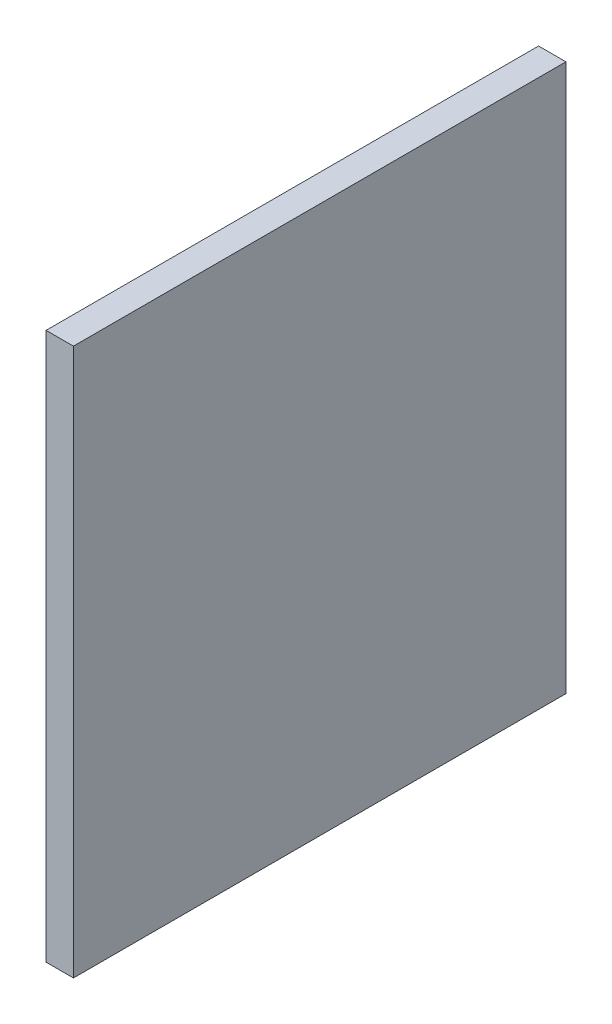
ISO-10303-21;
HEADER;
FILE_DESCRIPTION(('STEP AP214'),'2;1');
FILE_NAME('part.step','',(''),(''),'','','');
FILE_SCHEMA(('AUTOMOTIVE_DESIGN { 1 0 10303 214 1 1 1 1 }'));
ENDSEC;
DATA;
#1=APPLICATION_CONTEXT('core data for automotive mechanical design processes');
#2=APPLICATION_PROTOCOL_DEFINITION('international standard','automotive_design',2000,#1);
#3=PRODUCT_CONTEXT('',#1,'mechanical');
#4=PRODUCT('Part','Part','',(#3));
#5=PRODUCT_RELATED_PRODUCT_CATEGORY('part','',(#4));
#6=PRODUCT_DEFINITION_FORMATION('','',#4);
#7=PRODUCT_DEFINITION_CONTEXT('part definition',#1,'design');
#8=PRODUCT_DEFINITION('design','',#6,#7);
#9=PRODUCT_DEFINITION_SHAPE('','',#8);
#10=(LENGTH_UNIT() NAMED_UNIT(*) SI_UNIT(.MILLI.,.METRE.));
#11=(NAMED_UNIT(*) PLANE_ANGLE_UNIT() SI_UNIT($,.RADIAN.));
#12=(NAMED_UNIT(*) SI_UNIT($,.STERADIAN.) SOLID_ANGLE_UNIT());
#13=UNCERTAINTY_MEASURE_WITH_UNIT(LENGTH_MEASURE(1.E-05),#10,'distance_accuracy_value','');
#14=(GEOMETRIC_REPRESENTATION_CONTEXT(3) GLOBAL_UNCERTAINTY_ASSIGNED_CONTEXT((#13)) GLOBAL_UNIT_ASSIGNED_CONTEXT((#10,
#11,#12)) REPRESENTATION_CONTEXT('',''));
#15=CARTESIAN_POINT('',(0.,0.,0.));
#16=DIRECTION('',(0.,0.,1.));
#17=DIRECTION('',(1.,0.,0.));
#18=AXIS2_PLACEMENT_3D('',#15,#16,#17);
#19=CARTESIAN_POINT('',(10.,0.,0.));
#20=DIRECTION('',(0.,1.,0.));
#21=DIRECTION('',(0.,0.,1.));
#22=AXIS2_PLACEMENT_3D('',#19,#20,#21);
#23=PLANE('',#22);
#24=DIRECTION('',(1.,0.,0.));
#25=VECTOR('',#24,1.);
#26=CARTESIAN_POINT('',(0.,0.,-150.));
#27=LINE('',#26,#25);
#28=CARTESIAN_POINT('',(0.,0.,-150.));
#29=VERTEX_POINT('',#28);
#30=CARTESIAN_POINT('',(10.,0.,-150.));
#31=VERTEX_POINT('',#30);
#32=EDGE_CURVE('E116',#29,#31,#27,.T.);
#33=ORIENTED_EDGE('',*,*,#32,.F.);
#34=DIRECTION('',(0.,0.,-1.));
#35=VECTOR('',#34,1.);
#36=CARTESIAN_POINT('',(0.,0.,0.));
#37=LINE('',#36,#35);
#38=CARTESIAN_POINT('',(0.,0.,-330.));
#39=VERTEX_POINT('',#38);
#40=EDGE_CURVE('E90',#29,#39,#37,.T.);
#41=ORIENTED_EDGE('',*,*,#40,.T.);
#42=DIRECTION('',(-1.,0.,0.));
#43=VECTOR('',#42,1.);
#44=CARTESIAN_POINT('',(10.,0.,-330.));
#45=LINE('',#44,#43);
#46=CARTESIAN_POINT('',(10.,0.,-330.));
#47=VERTEX_POINT('',#46);
#48=EDGE_CURVE('E11',#47,#39,#45,.T.);
#49=ORIENTED_EDGE('',*,*,#48,.F.);
#50=DIRECTION('',(0.,0.,-1.));
#51=VECTOR('',#50,1.);
#52=CARTESIAN_POINT('',(10.,0.,0.));
#53=LINE('',#52,#51);
#54=EDGE_CURVE('E100',#31,#47,#53,.T.);
#55=ORIENTED_EDGE('',*,*,#54,.F.);
#56=EDGE_LOOP('',(#33,#41,#49,#55));
#57=FACE_BOUND('',#56,.T.);
#58=ADVANCED_FACE('F44',(#57),#23,.F.);
#59=CARTESIAN_POINT('',(10.,200.,0.));
#60=DIRECTION('',(0.,-1.,0.));
#61=DIRECTION('',(0.,0.,-1.));
#62=AXIS2_PLACEMENT_3D('',#59,#60,#61);
#63=PLANE('',#62);
#64=DIRECTION('',(-1.,0.,0.));
#65=VECTOR('',#64,1.);
#66=CARTESIAN_POINT('',(0.,200.,-150.));
#67=LINE('',#66,#65);
#68=CARTESIAN_POINT('',(10.,200.,-150.));
#69=VERTEX_POINT('',#68);
#70=CARTESIAN_POINT('',(0.,200.,-150.));
#71=VERTEX_POINT('',#70);
#72=EDGE_CURVE('E59',#69,#71,#67,.T.);
#73=ORIENTED_EDGE('',*,*,#72,.F.);
#74=DIRECTION('',(0.,0.,1.));
#75=VECTOR('',#74,1.);
#76=CARTESIAN_POINT('',(10.,200.,0.));
#77=LINE('',#76,#75);
#78=CARTESIAN_POINT('',(10.,200.,-330.));
#79=VERTEX_POINT('',#78);
#80=EDGE_CURVE('E95',#79,#69,#77,.T.);
#81=ORIENTED_EDGE('',*,*,#80,.F.);
#82=DIRECTION('',(-1.,0.,0.));
#83=VECTOR('',#82,1.);
#84=CARTESIAN_POINT('',(10.,200.,-330.));
#85=LINE('',#84,#83);
#86=CARTESIAN_POINT('',(0.,200.,-330.));
#87=VERTEX_POINT('',#86);
#88=EDGE_CURVE('E52',#79,#87,#85,.T.);
#89=ORIENTED_EDGE('',*,*,#88,.T.);
#90=DIRECTION('',(0.,0.,1.));
#91=VECTOR('',#90,1.);
#92=CARTESIAN_POINT('',(0.,200.,0.));
#93=LINE('',#92,#91);
#94=EDGE_CURVE('E89',#87,#71,#93,.T.);
#95=ORIENTED_EDGE('',*,*,#94,.T.);
#96=EDGE_LOOP('',(#73,#81,#89,#95));
#97=FACE_BOUND('',#96,.T.);
#98=ADVANCED_FACE('F94',(#97),#63,.F.);
#99=CARTESIAN_POINT('',(10.,0.,0.));
#100=DIRECTION('',(-1.,0.,0.));
#101=DIRECTION('',(0.,0.,1.));
#102=AXIS2_PLACEMENT_3D('',#99,#100,#101);
#103=PLANE('',#102);
#104=DIRECTION('',(0.,1.,0.));
#105=VECTOR('',#104,1.);
#106=CARTESIAN_POINT('',(10.,200.,-150.));
#107=LINE('',#106,#105);
#108=EDGE_CURVE('E113',#31,#69,#107,.T.);
#109=ORIENTED_EDGE('',*,*,#108,.F.);
#110=ORIENTED_EDGE('',*,*,#54,.T.);
#111=DIRECTION('',(0.,1.,0.));
#112=VECTOR('',#111,1.);
#113=CARTESIAN_POINT('',(10.,0.,-330.));
#114=LINE('',#113,#112);
#115=EDGE_CURVE('E68',#47,#79,#114,.T.);
#116=ORIENTED_EDGE('',*,*,#115,.T.);
#117=ORIENTED_EDGE('',*,*,#80,.T.);
#118=EDGE_LOOP('',(#109,#110,#116,#117));
#119=FACE_BOUND('',#118,.T.);
#120=ADVANCED_FACE('F130',(#119),#103,.F.);
#121=CARTESIAN_POINT('',(0.,0.,0.));
#122=DIRECTION('',(-1.,0.,0.));
#123=DIRECTION('',(0.,0.,1.));
#124=AXIS2_PLACEMENT_3D('',#121,#122,#123);
#125=PLANE('',#124);
#126=ORIENTED_EDGE('',*,*,#40,.F.);
#127=DIRECTION('',(0.,-1.,0.));
#128=VECTOR('',#127,1.);
#129=CARTESIAN_POINT('',(0.,200.,-150.));
#130=LINE('',#129,#128);
#131=EDGE_CURVE('E98',#71,#29,#130,.T.);
#132=ORIENTED_EDGE('',*,*,#131,.F.);
#133=ORIENTED_EDGE('',*,*,#94,.F.);
#134=DIRECTION('',(0.,1.,0.));
#135=VECTOR('',#134,1.);
#136=CARTESIAN_POINT('',(0.,0.,-330.));
#137=LINE('',#136,#135);
#138=EDGE_CURVE('E80',#39,#87,#137,.T.);
#139=ORIENTED_EDGE('',*,*,#138,.F.);
#140=EDGE_LOOP('',(#126,#132,#133,#139));
#141=FACE_BOUND('',#140,.T.);
#142=ADVANCED_FACE('F97',(#141),#125,.T.);
#143=CARTESIAN_POINT('',(10.,0.,-330.));
#144=DIRECTION('',(0.,0.,1.));
#145=DIRECTION('',(1.,0.,0.));
#146=AXIS2_PLACEMENT_3D('',#143,#144,#145);
#147=PLANE('',#146);
#148=ORIENTED_EDGE('',*,*,#138,.T.);
#149=ORIENTED_EDGE('',*,*,#88,.F.);
#150=ORIENTED_EDGE('',*,*,#115,.F.);
#151=ORIENTED_EDGE('',*,*,#48,.T.);
#152=EDGE_LOOP('',(#148,#149,#150,#151));
#153=FACE_BOUND('',#152,.T.);
#154=ADVANCED_FACE('F82',(#153),#147,.F.);
#155=CARTESIAN_POINT('',(0.,0.,-150.));
#156=DIRECTION('',(0.,0.,1.));
#157=DIRECTION('',(1.,0.,0.));
#158=AXIS2_PLACEMENT_3D('',#155,#156,#157);
#159=PLANE('',#158);
#160=ORIENTED_EDGE('',*,*,#131,.T.);
#161=ORIENTED_EDGE('',*,*,#32,.T.);
#162=ORIENTED_EDGE('',*,*,#108,.T.);
#163=ORIENTED_EDGE('',*,*,#72,.T.);
#164=EDGE_LOOP('',(#160,#161,#162,#163));
#165=FACE_BOUND('',#164,.T.);
#166=ADVANCED_FACE('F123',(#165),#159,.T.);
#167=CLOSED_SHELL('',(#58,#98,#120,#142,#154,#166));
#168=MANIFOLD_SOLID_BREP('B2',#167);
#169=ADVANCED_BREP_SHAPE_REPRESENTATION('',(#18,#168),#14);
#170=SHAPE_DEFINITION_REPRESENTATION(#9,#169);
ENDSEC;
END-ISO-10303-21;
